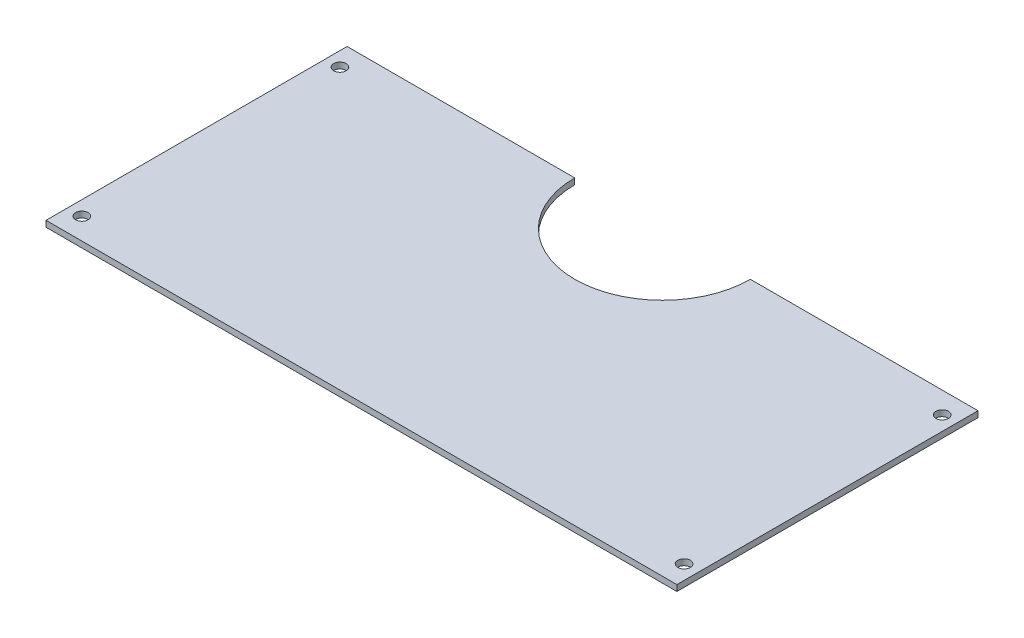
ISO-10303-21;
HEADER;
FILE_DESCRIPTION(('STEP AP214'),'2;1');
FILE_NAME('part.step','',(''),(''),'','','');
FILE_SCHEMA(('AUTOMOTIVE_DESIGN { 1 0 10303 214 1 1 1 1 }'));
ENDSEC;
DATA;
#1=APPLICATION_CONTEXT('core data for automotive mechanical design processes');
#2=APPLICATION_PROTOCOL_DEFINITION('international standard','automotive_design',2000,#1);
#3=PRODUCT_CONTEXT('',#1,'mechanical');
#4=PRODUCT('Part','Part','',(#3));
#5=PRODUCT_RELATED_PRODUCT_CATEGORY('part','',(#4));
#6=PRODUCT_DEFINITION_FORMATION('','',#4);
#7=PRODUCT_DEFINITION_CONTEXT('part definition',#1,'design');
#8=PRODUCT_DEFINITION('design','',#6,#7);
#9=PRODUCT_DEFINITION_SHAPE('','',#8);
#10=(LENGTH_UNIT() NAMED_UNIT(*) SI_UNIT(.MILLI.,.METRE.));
#11=(NAMED_UNIT(*) PLANE_ANGLE_UNIT() SI_UNIT($,.RADIAN.));
#12=(NAMED_UNIT(*) SI_UNIT($,.STERADIAN.) SOLID_ANGLE_UNIT());
#13=UNCERTAINTY_MEASURE_WITH_UNIT(LENGTH_MEASURE(1.E-05),#10,'distance_accuracy_value','');
#14=(GEOMETRIC_REPRESENTATION_CONTEXT(3) GLOBAL_UNCERTAINTY_ASSIGNED_CONTEXT((#13)) GLOBAL_UNIT_ASSIGNED_CONTEXT((#10,
#11,#12)) REPRESENTATION_CONTEXT('',''));
#15=CARTESIAN_POINT('',(0.,0.,0.));
#16=DIRECTION('',(0.,0.,1.));
#17=DIRECTION('',(1.,0.,0.));
#18=AXIS2_PLACEMENT_3D('',#15,#16,#17);
#19=CARTESIAN_POINT('',(-139.7,1.3335,-66.675));
#20=DIRECTION('',(0.,0.,1.));
#21=DIRECTION('',(1.,0.,0.));
#22=AXIS2_PLACEMENT_3D('',#19,#20,#21);
#23=PLANE('',#22);
#24=DIRECTION('',(-1.,0.,0.));
#25=VECTOR('',#24,1.);
#26=CARTESIAN_POINT('',(-139.7,-1.3335,-66.675));
#27=LINE('',#26,#25);
#28=CARTESIAN_POINT('',(139.7,-1.3335,-66.675));
#29=VERTEX_POINT('',#28);
#30=CARTESIAN_POINT('',(38.8874,-1.3335,-66.675));
#31=VERTEX_POINT('',#30);
#32=EDGE_CURVE('E111',#29,#31,#27,.T.);
#33=ORIENTED_EDGE('',*,*,#32,.T.);
#34=DIRECTION('',(0.,1.,0.));
#35=VECTOR('',#34,1.);
#36=CARTESIAN_POINT('',(38.8874,-1.3335,-66.675));
#37=LINE('',#36,#35);
#38=CARTESIAN_POINT('',(38.8874,1.3335,-66.675));
#39=VERTEX_POINT('',#38);
#40=EDGE_CURVE('E58',#39,#31,#37,.F.);
#41=ORIENTED_EDGE('',*,*,#40,.F.);
#42=DIRECTION('',(-1.,0.,0.));
#43=VECTOR('',#42,1.);
#44=CARTESIAN_POINT('',(-139.7,1.3335,-66.675));
#45=LINE('',#44,#43);
#46=CARTESIAN_POINT('',(139.7,1.3335,-66.675));
#47=VERTEX_POINT('',#46);
#48=EDGE_CURVE('E94',#47,#39,#45,.T.);
#49=ORIENTED_EDGE('',*,*,#48,.F.);
#50=DIRECTION('',(0.,-1.,0.));
#51=VECTOR('',#50,1.);
#52=CARTESIAN_POINT('',(139.7,1.3335,-66.675));
#53=LINE('',#52,#51);
#54=EDGE_CURVE('E11',#47,#29,#53,.T.);
#55=ORIENTED_EDGE('',*,*,#54,.T.);
#56=EDGE_LOOP('',(#33,#41,#49,#55));
#57=FACE_BOUND('',#56,.T.);
#58=ADVANCED_FACE('F43',(#57),#23,.F.);
#59=CARTESIAN_POINT('',(139.7,1.3335,66.675));
#60=DIRECTION('',(-1.,0.,0.));
#61=DIRECTION('',(0.,0.,1.));
#62=AXIS2_PLACEMENT_3D('',#59,#60,#61);
#63=PLANE('',#62);
#64=DIRECTION('',(0.,0.,-1.));
#65=VECTOR('',#64,1.);
#66=CARTESIAN_POINT('',(139.7,-1.3335,66.675));
#67=LINE('',#66,#65);
#68=CARTESIAN_POINT('',(139.7,-1.3335,66.675));
#69=VERTEX_POINT('',#68);
#70=EDGE_CURVE('E125',#69,#29,#67,.T.);
#71=ORIENTED_EDGE('',*,*,#70,.T.);
#72=ORIENTED_EDGE('',*,*,#54,.F.);
#73=DIRECTION('',(0.,0.,-1.));
#74=VECTOR('',#73,1.);
#75=CARTESIAN_POINT('',(139.7,1.3335,66.675));
#76=LINE('',#75,#74);
#77=CARTESIAN_POINT('',(139.7,1.3335,66.675));
#78=VERTEX_POINT('',#77);
#79=EDGE_CURVE('E115',#78,#47,#76,.T.);
#80=ORIENTED_EDGE('',*,*,#79,.F.);
#81=DIRECTION('',(0.,-1.,0.));
#82=VECTOR('',#81,1.);
#83=CARTESIAN_POINT('',(139.7,1.3335,66.675));
#84=LINE('',#83,#82);
#85=EDGE_CURVE('E124',#78,#69,#84,.T.);
#86=ORIENTED_EDGE('',*,*,#85,.T.);
#87=EDGE_LOOP('',(#71,#72,#80,#86));
#88=FACE_BOUND('',#87,.T.);
#89=ADVANCED_FACE('F45',(#88),#63,.F.);
#90=CARTESIAN_POINT('',(-38.8874,1.3335,-66.675));
#91=VERTEX_POINT('',#90);
#92=CARTESIAN_POINT('',(-139.7,1.3335,-66.675));
#93=VERTEX_POINT('',#92);
#94=EDGE_CURVE('E118',#91,#93,#45,.T.);
#95=ORIENTED_EDGE('',*,*,#94,.F.);
#96=DIRECTION('',(0.,1.,0.));
#97=VECTOR('',#96,1.);
#98=CARTESIAN_POINT('',(-38.8874,-1.3335,-66.675));
#99=LINE('',#98,#97);
#100=CARTESIAN_POINT('',(-38.8874,-1.3335,-66.675));
#101=VERTEX_POINT('',#100);
#102=EDGE_CURVE('E106',#101,#91,#99,.T.);
#103=ORIENTED_EDGE('',*,*,#102,.F.);
#104=CARTESIAN_POINT('',(-139.7,-1.3335,-66.675));
#105=VERTEX_POINT('',#104);
#106=EDGE_CURVE('E128',#101,#105,#27,.T.);
#107=ORIENTED_EDGE('',*,*,#106,.T.);
#108=DIRECTION('',(0.,-1.,0.));
#109=VECTOR('',#108,1.);
#110=CARTESIAN_POINT('',(-139.7,1.3335,-66.675));
#111=LINE('',#110,#109);
#112=EDGE_CURVE('E51',#93,#105,#111,.T.);
#113=ORIENTED_EDGE('',*,*,#112,.F.);
#114=EDGE_LOOP('',(#95,#103,#107,#113));
#115=FACE_BOUND('',#114,.T.);
#116=ADVANCED_FACE('F158',(#115),#23,.F.);
#117=CARTESIAN_POINT('',(-139.7,1.3335,66.675));
#118=DIRECTION('',(1.,0.,0.));
#119=DIRECTION('',(0.,0.,-1.));
#120=AXIS2_PLACEMENT_3D('',#117,#118,#119);
#121=PLANE('',#120);
#122=DIRECTION('',(0.,0.,1.));
#123=VECTOR('',#122,1.);
#124=CARTESIAN_POINT('',(-139.7,-1.3335,66.675));
#125=LINE('',#124,#123);
#126=CARTESIAN_POINT('',(-139.7,-1.3335,66.675));
#127=VERTEX_POINT('',#126);
#128=EDGE_CURVE('E130',#105,#127,#125,.T.);
#129=ORIENTED_EDGE('',*,*,#128,.T.);
#130=DIRECTION('',(0.,-1.,0.));
#131=VECTOR('',#130,1.);
#132=CARTESIAN_POINT('',(-139.7,1.3335,66.675));
#133=LINE('',#132,#131);
#134=CARTESIAN_POINT('',(-139.7,1.3335,66.675));
#135=VERTEX_POINT('',#134);
#136=EDGE_CURVE('E134',#135,#127,#133,.T.);
#137=ORIENTED_EDGE('',*,*,#136,.F.);
#138=DIRECTION('',(0.,0.,1.));
#139=VECTOR('',#138,1.);
#140=CARTESIAN_POINT('',(-139.7,1.3335,66.675));
#141=LINE('',#140,#139);
#142=EDGE_CURVE('E117',#93,#135,#141,.T.);
#143=ORIENTED_EDGE('',*,*,#142,.F.);
#144=ORIENTED_EDGE('',*,*,#112,.T.);
#145=EDGE_LOOP('',(#129,#137,#143,#144));
#146=FACE_BOUND('',#145,.T.);
#147=ADVANCED_FACE('F140',(#146),#121,.F.);
#148=CARTESIAN_POINT('',(-139.7,1.3335,66.675));
#149=DIRECTION('',(0.,0.,-1.));
#150=DIRECTION('',(-1.,0.,0.));
#151=AXIS2_PLACEMENT_3D('',#148,#149,#150);
#152=PLANE('',#151);
#153=DIRECTION('',(1.,0.,0.));
#154=VECTOR('',#153,1.);
#155=CARTESIAN_POINT('',(-139.7,-1.3335,66.675));
#156=LINE('',#155,#154);
#157=EDGE_CURVE('E88',#127,#69,#156,.T.);
#158=ORIENTED_EDGE('',*,*,#157,.T.);
#159=ORIENTED_EDGE('',*,*,#85,.F.);
#160=DIRECTION('',(1.,0.,0.));
#161=VECTOR('',#160,1.);
#162=CARTESIAN_POINT('',(-139.7,1.3335,66.675));
#163=LINE('',#162,#161);
#164=EDGE_CURVE('E67',#135,#78,#163,.T.);
#165=ORIENTED_EDGE('',*,*,#164,.F.);
#166=ORIENTED_EDGE('',*,*,#136,.T.);
#167=EDGE_LOOP('',(#158,#159,#165,#166));
#168=FACE_BOUND('',#167,.T.);
#169=ADVANCED_FACE('F148',(#168),#152,.F.);
#170=CARTESIAN_POINT('',(0.,1.3335,0.));
#171=DIRECTION('',(0.,-1.,0.));
#172=DIRECTION('',(0.,0.,-1.));
#173=AXIS2_PLACEMENT_3D('',#170,#171,#172);
#174=PLANE('',#173);
#175=CARTESIAN_POINT('',(133.35,1.3335,57.15));
#176=DIRECTION('',(0.,1.,0.));
#177=DIRECTION('',(0.,0.,1.));
#178=AXIS2_PLACEMENT_3D('',#175,#176,#177);
#179=CIRCLE('',#178,2.76860000000001);
#180=CARTESIAN_POINT('',(133.35,1.3335,59.9186));
#181=VERTEX_POINT('',#180);
#182=EDGE_CURVE('E176',#181,#181,#179,.T.);
#183=ORIENTED_EDGE('',*,*,#182,.F.);
#184=EDGE_LOOP('',(#183));
#185=FACE_BOUND('',#184,.T.);
#186=CARTESIAN_POINT('',(-133.35,1.3335,-57.15));
#187=DIRECTION('',(0.,1.,0.));
#188=DIRECTION('',(0.,0.,1.));
#189=AXIS2_PLACEMENT_3D('',#186,#187,#188);
#190=CIRCLE('',#189,2.76860000000001);
#191=CARTESIAN_POINT('',(-133.35,1.3335,-54.3814));
#192=VERTEX_POINT('',#191);
#193=EDGE_CURVE('E181',#192,#192,#190,.T.);
#194=ORIENTED_EDGE('',*,*,#193,.F.);
#195=EDGE_LOOP('',(#194));
#196=FACE_BOUND('',#195,.T.);
#197=CARTESIAN_POINT('',(133.35,1.3335,-57.15));
#198=DIRECTION('',(0.,1.,0.));
#199=DIRECTION('',(0.,0.,1.));
#200=AXIS2_PLACEMENT_3D('',#197,#198,#199);
#201=CIRCLE('',#200,2.76860000000001);
#202=CARTESIAN_POINT('',(133.35,1.3335,-54.3814));
#203=VERTEX_POINT('',#202);
#204=EDGE_CURVE('E182',#203,#203,#201,.T.);
#205=ORIENTED_EDGE('',*,*,#204,.F.);
#206=EDGE_LOOP('',(#205));
#207=FACE_BOUND('',#206,.T.);
#208=CARTESIAN_POINT('',(-133.35,1.3335,57.15));
#209=DIRECTION('',(0.,1.,0.));
#210=DIRECTION('',(0.,0.,1.));
#211=AXIS2_PLACEMENT_3D('',#208,#209,#210);
#212=CIRCLE('',#211,2.76860000000001);
#213=CARTESIAN_POINT('',(-133.35,1.3335,59.9186));
#214=VERTEX_POINT('',#213);
#215=EDGE_CURVE('E171',#214,#214,#212,.T.);
#216=ORIENTED_EDGE('',*,*,#215,.F.);
#217=EDGE_LOOP('',(#216));
#218=FACE_BOUND('',#217,.T.);
#219=ORIENTED_EDGE('',*,*,#48,.T.);
#220=CARTESIAN_POINT('',(0.,1.3335,-66.675));
#221=DIRECTION('',(0.,1.,0.));
#222=DIRECTION('',(0.,0.,1.));
#223=AXIS2_PLACEMENT_3D('',#220,#221,#222);
#224=CIRCLE('',#223,38.8874);
#225=EDGE_CURVE('E103',#91,#39,#224,.T.);
#226=ORIENTED_EDGE('',*,*,#225,.F.);
#227=ORIENTED_EDGE('',*,*,#94,.T.);
#228=ORIENTED_EDGE('',*,*,#142,.T.);
#229=ORIENTED_EDGE('',*,*,#164,.T.);
#230=ORIENTED_EDGE('',*,*,#79,.T.);
#231=EDGE_LOOP('',(#219,#226,#227,#228,#229,#230));
#232=FACE_BOUND('',#231,.T.);
#233=ADVANCED_FACE('F113',(#185,#196,#207,#218,#232),#174,.F.);
#234=CARTESIAN_POINT('',(0.,-1.3335,0.));
#235=DIRECTION('',(0.,-1.,0.));
#236=DIRECTION('',(0.,0.,-1.));
#237=AXIS2_PLACEMENT_3D('',#234,#235,#236);
#238=PLANE('',#237);
#239=CARTESIAN_POINT('',(133.35,-1.3335,57.15));
#240=DIRECTION('',(0.,1.,0.));
#241=DIRECTION('',(0.,0.,1.));
#242=AXIS2_PLACEMENT_3D('',#239,#240,#241);
#243=CIRCLE('',#242,2.76860000000001);
#244=CARTESIAN_POINT('',(133.35,-1.3335,59.9186));
#245=VERTEX_POINT('',#244);
#246=EDGE_CURVE('E185',#245,#245,#243,.T.);
#247=ORIENTED_EDGE('',*,*,#246,.T.);
#248=EDGE_LOOP('',(#247));
#249=FACE_BOUND('',#248,.T.);
#250=CARTESIAN_POINT('',(-133.35,-1.3335,-57.15));
#251=DIRECTION('',(0.,1.,0.));
#252=DIRECTION('',(0.,0.,1.));
#253=AXIS2_PLACEMENT_3D('',#250,#251,#252);
#254=CIRCLE('',#253,2.76860000000001);
#255=CARTESIAN_POINT('',(-133.35,-1.3335,-54.3814));
#256=VERTEX_POINT('',#255);
#257=EDGE_CURVE('E178',#256,#256,#254,.T.);
#258=ORIENTED_EDGE('',*,*,#257,.T.);
#259=EDGE_LOOP('',(#258));
#260=FACE_BOUND('',#259,.T.);
#261=CARTESIAN_POINT('',(133.35,-1.3335,-57.15));
#262=DIRECTION('',(0.,1.,0.));
#263=DIRECTION('',(0.,0.,1.));
#264=AXIS2_PLACEMENT_3D('',#261,#262,#263);
#265=CIRCLE('',#264,2.76860000000001);
#266=CARTESIAN_POINT('',(133.35,-1.3335,-54.3814));
#267=VERTEX_POINT('',#266);
#268=EDGE_CURVE('E190',#267,#267,#265,.T.);
#269=ORIENTED_EDGE('',*,*,#268,.T.);
#270=EDGE_LOOP('',(#269));
#271=FACE_BOUND('',#270,.T.);
#272=CARTESIAN_POINT('',(-133.35,-1.3335,57.15));
#273=DIRECTION('',(0.,1.,0.));
#274=DIRECTION('',(0.,0.,1.));
#275=AXIS2_PLACEMENT_3D('',#272,#273,#274);
#276=CIRCLE('',#275,2.76860000000001);
#277=CARTESIAN_POINT('',(-133.35,-1.3335,59.9186));
#278=VERTEX_POINT('',#277);
#279=EDGE_CURVE('E168',#278,#278,#276,.T.);
#280=ORIENTED_EDGE('',*,*,#279,.T.);
#281=EDGE_LOOP('',(#280));
#282=FACE_BOUND('',#281,.T.);
#283=CARTESIAN_POINT('',(0.,-1.3335,-66.675));
#284=DIRECTION('',(0.,1.,0.));
#285=DIRECTION('',(0.,0.,1.));
#286=AXIS2_PLACEMENT_3D('',#283,#284,#285);
#287=CIRCLE('',#286,38.8874);
#288=EDGE_CURVE('E108',#101,#31,#287,.T.);
#289=ORIENTED_EDGE('',*,*,#288,.T.);
#290=ORIENTED_EDGE('',*,*,#32,.F.);
#291=ORIENTED_EDGE('',*,*,#70,.F.);
#292=ORIENTED_EDGE('',*,*,#157,.F.);
#293=ORIENTED_EDGE('',*,*,#128,.F.);
#294=ORIENTED_EDGE('',*,*,#106,.F.);
#295=EDGE_LOOP('',(#289,#290,#291,#292,#293,#294));
#296=FACE_BOUND('',#295,.T.);
#297=ADVANCED_FACE('F145',(#249,#260,#271,#282,#296),#238,.T.);
#298=CARTESIAN_POINT('',(0.,-1.3335,-66.675));
#299=DIRECTION('',(0.,1.,0.));
#300=DIRECTION('',(0.,0.,1.));
#301=AXIS2_PLACEMENT_3D('',#298,#299,#300);
#302=CYLINDRICAL_SURFACE('',#301,38.8874);
#303=ORIENTED_EDGE('',*,*,#40,.T.);
#304=ORIENTED_EDGE('',*,*,#288,.F.);
#305=ORIENTED_EDGE('',*,*,#102,.T.);
#306=ORIENTED_EDGE('',*,*,#225,.T.);
#307=EDGE_LOOP('',(#303,#304,#305,#306));
#308=FACE_BOUND('',#307,.T.);
#309=ADVANCED_FACE('F104',(#308),#302,.F.);
#310=CARTESIAN_POINT('',(-133.35,-1.3335,57.15));
#311=DIRECTION('',(0.,1.,0.));
#312=DIRECTION('',(0.,0.,1.));
#313=AXIS2_PLACEMENT_3D('',#310,#311,#312);
#314=CYLINDRICAL_SURFACE('',#313,2.76860000000001);
#315=ORIENTED_EDGE('',*,*,#279,.F.);
#316=EDGE_LOOP('',(#315));
#317=FACE_BOUND('',#316,.T.);
#318=ORIENTED_EDGE('',*,*,#215,.T.);
#319=EDGE_LOOP('',(#318));
#320=FACE_BOUND('',#319,.T.);
#321=ADVANCED_FACE('F201',(#317,#320),#314,.F.);
#322=CARTESIAN_POINT('',(133.35,-1.3335,-57.15));
#323=DIRECTION('',(0.,1.,0.));
#324=DIRECTION('',(0.,0.,1.));
#325=AXIS2_PLACEMENT_3D('',#322,#323,#324);
#326=CYLINDRICAL_SURFACE('',#325,2.76860000000001);
#327=ORIENTED_EDGE('',*,*,#268,.F.);
#328=EDGE_LOOP('',(#327));
#329=FACE_BOUND('',#328,.T.);
#330=ORIENTED_EDGE('',*,*,#204,.T.);
#331=EDGE_LOOP('',(#330));
#332=FACE_BOUND('',#331,.T.);
#333=ADVANCED_FACE('F196',(#329,#332),#326,.F.);
#334=CARTESIAN_POINT('',(-133.35,-1.3335,-57.15));
#335=DIRECTION('',(0.,1.,0.));
#336=DIRECTION('',(0.,0.,1.));
#337=AXIS2_PLACEMENT_3D('',#334,#335,#336);
#338=CYLINDRICAL_SURFACE('',#337,2.76860000000001);
#339=ORIENTED_EDGE('',*,*,#257,.F.);
#340=EDGE_LOOP('',(#339));
#341=FACE_BOUND('',#340,.T.);
#342=ORIENTED_EDGE('',*,*,#193,.T.);
#343=EDGE_LOOP('',(#342));
#344=FACE_BOUND('',#343,.T.);
#345=ADVANCED_FACE('F209',(#341,#344),#338,.F.);
#346=CARTESIAN_POINT('',(133.35,-1.3335,57.15));
#347=DIRECTION('',(0.,1.,0.));
#348=DIRECTION('',(0.,0.,1.));
#349=AXIS2_PLACEMENT_3D('',#346,#347,#348);
#350=CYLINDRICAL_SURFACE('',#349,2.76860000000001);
#351=ORIENTED_EDGE('',*,*,#246,.F.);
#352=EDGE_LOOP('',(#351));
#353=FACE_BOUND('',#352,.T.);
#354=ORIENTED_EDGE('',*,*,#182,.T.);
#355=EDGE_LOOP('',(#354));
#356=FACE_BOUND('',#355,.T.);
#357=ADVANCED_FACE('F228',(#353,#356),#350,.F.);
#358=CLOSED_SHELL('',(#58,#89,#116,#147,#169,#233,#297,#309,#321,#333,#345,#357));
#359=MANIFOLD_SOLID_BREP('B2',#358);
#360=ADVANCED_BREP_SHAPE_REPRESENTATION('',(#18,#359),#14);
#361=SHAPE_DEFINITION_REPRESENTATION(#9,#360);
ENDSEC;
END-ISO-10303-21;
